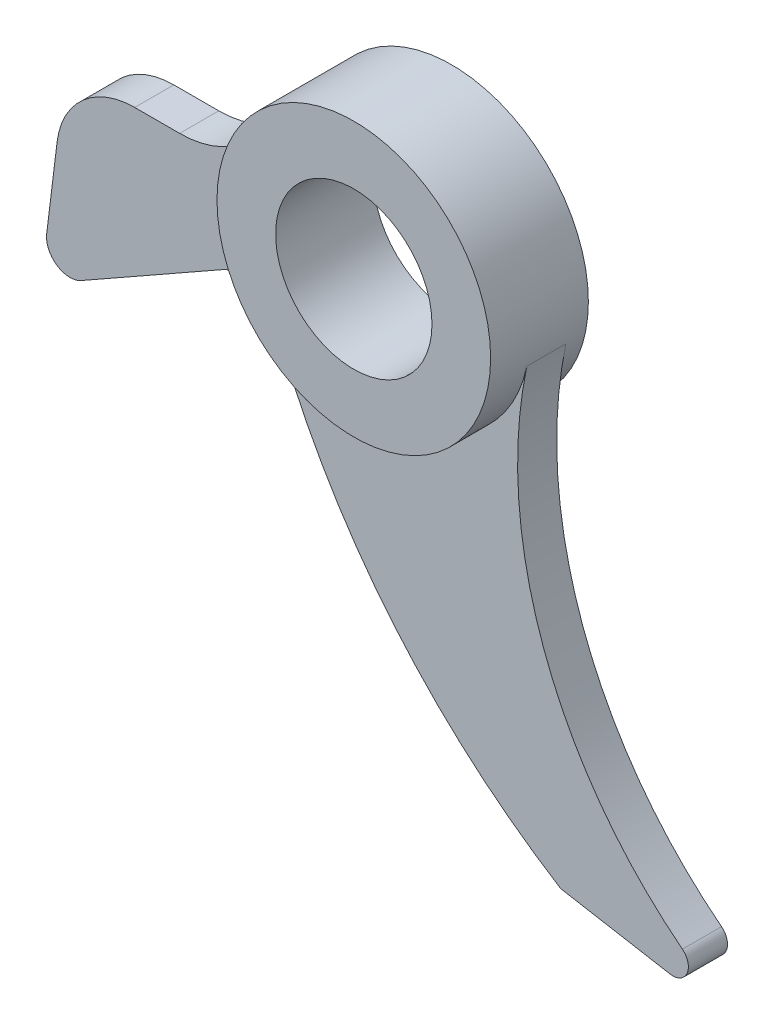
ISO-10303-21;
HEADER;
FILE_DESCRIPTION(('STEP AP214'),'2;1');
FILE_NAME('part.step','',(''),(''),'','','');
FILE_SCHEMA(('AUTOMOTIVE_DESIGN { 1 0 10303 214 1 1 1 1 }'));
ENDSEC;
DATA;
#1=APPLICATION_CONTEXT('core data for automotive mechanical design processes');
#2=APPLICATION_PROTOCOL_DEFINITION('international standard','automotive_design',2000,#1);
#3=PRODUCT_CONTEXT('',#1,'mechanical');
#4=PRODUCT('Part','Part','',(#3));
#5=PRODUCT_RELATED_PRODUCT_CATEGORY('part','',(#4));
#6=PRODUCT_DEFINITION_FORMATION('','',#4);
#7=PRODUCT_DEFINITION_CONTEXT('part definition',#1,'design');
#8=PRODUCT_DEFINITION('design','',#6,#7);
#9=PRODUCT_DEFINITION_SHAPE('','',#8);
#10=(LENGTH_UNIT() NAMED_UNIT(*) SI_UNIT(.MILLI.,.METRE.));
#11=(NAMED_UNIT(*) PLANE_ANGLE_UNIT() SI_UNIT($,.RADIAN.));
#12=(NAMED_UNIT(*) SI_UNIT($,.STERADIAN.) SOLID_ANGLE_UNIT());
#13=UNCERTAINTY_MEASURE_WITH_UNIT(LENGTH_MEASURE(1.E-05),#10,'distance_accuracy_value','');
#14=(GEOMETRIC_REPRESENTATION_CONTEXT(3) GLOBAL_UNCERTAINTY_ASSIGNED_CONTEXT((#13)) GLOBAL_UNIT_ASSIGNED_CONTEXT((#10,
#11,#12)) REPRESENTATION_CONTEXT('',''));
#15=CARTESIAN_POINT('',(0.,0.,0.));
#16=DIRECTION('',(0.,0.,1.));
#17=DIRECTION('',(1.,0.,0.));
#18=AXIS2_PLACEMENT_3D('',#15,#16,#17);
#19=CARTESIAN_POINT('',(27.5928393996281,20.5375154884965,15.));
#20=DIRECTION('',(0.,0.,-1.));
#21=DIRECTION('',(-1.,0.,0.));
#22=AXIS2_PLACEMENT_3D('',#19,#20,#21);
#23=CYLINDRICAL_SURFACE('',#22,35.);
#24=CARTESIAN_POINT('',(27.5928393996281,20.5375154884965,5.));
#25=DIRECTION('',(0.,0.,1.));
#26=DIRECTION('',(1.,0.,0.));
#27=AXIS2_PLACEMENT_3D('',#24,#25,#26);
#28=CIRCLE('',#27,35.);
#29=CARTESIAN_POINT('',(-4.22423760139273,35.1208488218298,5.));
#30=VERTEX_POINT('',#29);
#31=CARTESIAN_POINT('',(61.844285818518,13.3376253355903,5.));
#32=VERTEX_POINT('',#31);
#33=EDGE_CURVE('E63',#30,#32,#28,.T.);
#34=ORIENTED_EDGE('',*,*,#33,.T.);
#35=DIRECTION('',(0.,0.,-1.));
#36=VECTOR('',#35,1.);
#37=CARTESIAN_POINT('',(61.844285818518,13.3376253355903,5.));
#38=LINE('',#37,#36);
#39=CARTESIAN_POINT('',(61.844285818518,13.3376253355903,-5.));
#40=VERTEX_POINT('',#39);
#41=EDGE_CURVE('E257',#32,#40,#38,.T.);
#42=ORIENTED_EDGE('',*,*,#41,.T.);
#43=CARTESIAN_POINT('',(27.5928393996281,20.5375154884965,-5.));
#44=DIRECTION('',(0.,0.,1.));
#45=DIRECTION('',(1.,0.,0.));
#46=AXIS2_PLACEMENT_3D('',#43,#44,#45);
#47=CIRCLE('',#46,35.);
#48=CARTESIAN_POINT('',(-4.22423760139273,35.1208488218298,-5.));
#49=VERTEX_POINT('',#48);
#50=EDGE_CURVE('E180',#49,#40,#47,.T.);
#51=ORIENTED_EDGE('',*,*,#50,.F.);
#52=DIRECTION('',(0.,0.,-1.));
#53=VECTOR('',#52,1.);
#54=CARTESIAN_POINT('',(-4.22423760139273,35.1208488218298,5.));
#55=LINE('',#54,#53);
#56=EDGE_CURVE('E66',#30,#49,#55,.T.);
#57=ORIENTED_EDGE('',*,*,#56,.F.);
#58=EDGE_LOOP('',(#34,#42,#51,#57));
#59=FACE_BOUND('',#58,.T.);
#60=CARTESIAN_POINT('',(27.5928393996281,20.5375154884965,15.));
#61=DIRECTION('',(0.,0.,1.));
#62=DIRECTION('',(1.,0.,0.));
#63=AXIS2_PLACEMENT_3D('',#60,#61,#62);
#64=CIRCLE('',#63,35.);
#65=CARTESIAN_POINT('',(62.5928393996281,20.5375154884965,15.));
#66=VERTEX_POINT('',#65);
#67=EDGE_CURVE('E60',#66,#66,#64,.T.);
#68=ORIENTED_EDGE('',*,*,#67,.F.);
#69=EDGE_LOOP('',(#68));
#70=FACE_BOUND('',#69,.T.);
#71=CARTESIAN_POINT('',(27.5928393996281,20.5375154884965,-10.));
#72=DIRECTION('',(0.,0.,1.));
#73=DIRECTION('',(1.,0.,0.));
#74=AXIS2_PLACEMENT_3D('',#71,#72,#73);
#75=CIRCLE('',#74,35.);
#76=CARTESIAN_POINT('',(62.5928393996281,20.5375154884965,-10.));
#77=VERTEX_POINT('',#76);
#78=EDGE_CURVE('E150',#77,#77,#75,.T.);
#79=ORIENTED_EDGE('',*,*,#78,.T.);
#80=EDGE_LOOP('',(#79));
#81=FACE_BOUND('',#80,.T.);
#82=ADVANCED_FACE('F47',(#59,#70,#81),#23,.T.);
#83=CARTESIAN_POINT('',(27.5928393996281,20.5375154884965,15.));
#84=DIRECTION('',(0.,0.,-1.));
#85=DIRECTION('',(-1.,0.,0.));
#86=AXIS2_PLACEMENT_3D('',#83,#84,#85);
#87=CYLINDRICAL_SURFACE('',#86,20.);
#88=CARTESIAN_POINT('',(27.5928393996281,20.5375154884965,15.));
#89=DIRECTION('',(0.,0.,1.));
#90=DIRECTION('',(1.,0.,0.));
#91=AXIS2_PLACEMENT_3D('',#88,#89,#90);
#92=CIRCLE('',#91,20.);
#93=CARTESIAN_POINT('',(47.5928393996281,20.5375154884965,15.));
#94=VERTEX_POINT('',#93);
#95=EDGE_CURVE('E11',#94,#94,#92,.T.);
#96=ORIENTED_EDGE('',*,*,#95,.T.);
#97=EDGE_LOOP('',(#96));
#98=FACE_BOUND('',#97,.T.);
#99=CARTESIAN_POINT('',(27.5928393996281,20.5375154884965,-10.));
#100=DIRECTION('',(0.,0.,1.));
#101=DIRECTION('',(1.,0.,0.));
#102=AXIS2_PLACEMENT_3D('',#99,#100,#101);
#103=CIRCLE('',#102,20.);
#104=CARTESIAN_POINT('',(47.5928393996281,20.5375154884965,-10.));
#105=VERTEX_POINT('',#104);
#106=EDGE_CURVE('E273',#105,#105,#103,.T.);
#107=ORIENTED_EDGE('',*,*,#106,.F.);
#108=EDGE_LOOP('',(#107));
#109=FACE_BOUND('',#108,.T.);
#110=ADVANCED_FACE('F287',(#98,#109),#87,.F.);
#111=CARTESIAN_POINT('',(0.,0.,15.));
#112=DIRECTION('',(0.,0.,1.));
#113=DIRECTION('',(1.,0.,0.));
#114=AXIS2_PLACEMENT_3D('',#111,#112,#113);
#115=PLANE('',#114);
#116=ORIENTED_EDGE('',*,*,#67,.T.);
#117=EDGE_LOOP('',(#116));
#118=FACE_BOUND('',#117,.T.);
#119=ORIENTED_EDGE('',*,*,#95,.F.);
#120=EDGE_LOOP('',(#119));
#121=FACE_BOUND('',#120,.T.);
#122=ADVANCED_FACE('F284',(#118,#121),#115,.T.);
#123=CARTESIAN_POINT('',(0.,0.,-10.));
#124=DIRECTION('',(0.,0.,1.));
#125=DIRECTION('',(1.,0.,0.));
#126=AXIS2_PLACEMENT_3D('',#123,#124,#125);
#127=PLANE('',#126);
#128=ORIENTED_EDGE('',*,*,#78,.F.);
#129=EDGE_LOOP('',(#128));
#130=FACE_BOUND('',#129,.T.);
#131=ORIENTED_EDGE('',*,*,#106,.T.);
#132=EDGE_LOOP('',(#131));
#133=FACE_BOUND('',#132,.T.);
#134=ADVANCED_FACE('F286',(#130,#133),#127,.F.);
#135=CARTESIAN_POINT('',(-11.0627773534914,-12.8665463943155,5.));
#136=DIRECTION('',(0.,0.,-1.));
#137=DIRECTION('',(-1.,0.,0.));
#138=AXIS2_PLACEMENT_3D('',#135,#136,#137);
#139=CYLINDRICAL_SURFACE('',#138,9.99999999999999);
#140=DIRECTION('',(0.,0.,-1.));
#141=VECTOR('',#140,1.);
#142=CARTESIAN_POINT('',(-15.9936966431084,-4.16677427320317,5.));
#143=LINE('',#142,#141);
#144=CARTESIAN_POINT('',(-15.9936966431084,-4.16677427320317,5.));
#145=VERTEX_POINT('',#144);
#146=CARTESIAN_POINT('',(-15.9936966431084,-4.16677427320317,-5.));
#147=VERTEX_POINT('',#146);
#148=EDGE_CURVE('E152',#145,#147,#143,.T.);
#149=ORIENTED_EDGE('',*,*,#148,.T.);
#150=CARTESIAN_POINT('',(-11.0627773534914,-12.8665463943155,-5.));
#151=DIRECTION('',(0.,0.,1.));
#152=DIRECTION('',(1.,0.,0.));
#153=AXIS2_PLACEMENT_3D('',#150,#151,#152);
#154=CIRCLE('',#153,9.99999999999999);
#155=CARTESIAN_POINT('',(-1.06278127454067,-12.8754019558132,-5.));
#156=VERTEX_POINT('',#155);
#157=EDGE_CURVE('E151',#156,#147,#154,.T.);
#158=ORIENTED_EDGE('',*,*,#157,.F.);
#159=DIRECTION('',(0.,0.,-1.));
#160=VECTOR('',#159,1.);
#161=CARTESIAN_POINT('',(-1.06278127454067,-12.8754019558132,5.));
#162=LINE('',#161,#160);
#163=CARTESIAN_POINT('',(-1.06278127454067,-12.8754019558132,5.));
#164=VERTEX_POINT('',#163);
#165=EDGE_CURVE('E137',#164,#156,#162,.T.);
#166=ORIENTED_EDGE('',*,*,#165,.F.);
#167=CARTESIAN_POINT('',(-11.0627773534914,-12.8665463943155,5.));
#168=DIRECTION('',(0.,0.,1.));
#169=DIRECTION('',(1.,0.,0.));
#170=AXIS2_PLACEMENT_3D('',#167,#168,#169);
#171=CIRCLE('',#170,9.99999999999999);
#172=EDGE_CURVE('E202',#164,#145,#171,.T.);
#173=ORIENTED_EDGE('',*,*,#172,.T.);
#174=EDGE_LOOP('',(#149,#158,#166,#173));
#175=FACE_BOUND('',#174,.T.);
#176=ADVANCED_FACE('F155',(#175),#139,.F.);
#177=CARTESIAN_POINT('',(165.764836614489,54.7156174881517,5.));
#178=DIRECTION('',(0.,0.,-1.));
#179=DIRECTION('',(-1.,0.,0.));
#180=AXIS2_PLACEMENT_3D('',#177,#178,#179);
#181=CYLINDRICAL_SURFACE('',#180,180.000000000007);
#182=ORIENTED_EDGE('',*,*,#165,.T.);
#183=CARTESIAN_POINT('',(165.764836614489,54.7156174881517,-5.));
#184=DIRECTION('',(0.,0.,1.));
#185=DIRECTION('',(1.,0.,0.));
#186=AXIS2_PLACEMENT_3D('',#183,#184,#185);
#187=CIRCLE('',#186,180.000000000007);
#188=CARTESIAN_POINT('',(70.5461838212282,-98.0371506053889,-5.));
#189=VERTEX_POINT('',#188);
#190=EDGE_CURVE('E143',#156,#189,#187,.T.);
#191=ORIENTED_EDGE('',*,*,#190,.T.);
#192=DIRECTION('',(0.,0.,-1.));
#193=VECTOR('',#192,1.);
#194=CARTESIAN_POINT('',(70.5461838212282,-98.0371506053889,5.));
#195=LINE('',#194,#193);
#196=CARTESIAN_POINT('',(70.5461838212282,-98.0371506053889,5.));
#197=VERTEX_POINT('',#196);
#198=EDGE_CURVE('E146',#197,#189,#195,.T.);
#199=ORIENTED_EDGE('',*,*,#198,.F.);
#200=CARTESIAN_POINT('',(165.764836614489,54.7156174881517,5.));
#201=DIRECTION('',(0.,0.,1.));
#202=DIRECTION('',(1.,0.,0.));
#203=AXIS2_PLACEMENT_3D('',#200,#201,#202);
#204=CIRCLE('',#203,180.000000000007);
#205=EDGE_CURVE('E142',#164,#197,#204,.T.);
#206=ORIENTED_EDGE('',*,*,#205,.F.);
#207=EDGE_LOOP('',(#182,#191,#199,#206));
#208=FACE_BOUND('',#207,.T.);
#209=ADVANCED_FACE('F140',(#208),#181,.T.);
#210=CARTESIAN_POINT('',(-14.6381124207408,-83.016860845267,5.));
#211=DIRECTION('',(0.173648177666931,0.984807753012208,0.));
#212=DIRECTION('',(-0.984807753012208,0.173648177666931,0.));
#213=AXIS2_PLACEMENT_3D('',#210,#211,#212);
#214=PLANE('',#213);
#215=ORIENTED_EDGE('',*,*,#198,.T.);
#216=DIRECTION('',(0.984807753012208,-0.173648177666931,0.));
#217=VECTOR('',#216,1.);
#218=CARTESIAN_POINT('',(-14.6381124207408,-83.016860845267,-5.));
#219=LINE('',#218,#217);
#220=CARTESIAN_POINT('',(98.4843139750302,-102.963396742049,-5.));
#221=VERTEX_POINT('',#220);
#222=EDGE_CURVE('E163',#189,#221,#219,.T.);
#223=ORIENTED_EDGE('',*,*,#222,.T.);
#224=DIRECTION('',(0.,0.,-1.));
#225=VECTOR('',#224,1.);
#226=CARTESIAN_POINT('',(98.4843139750302,-102.963396742049,5.));
#227=LINE('',#226,#225);
#228=CARTESIAN_POINT('',(98.4843139750302,-102.963396742049,5.));
#229=VERTEX_POINT('',#228);
#230=EDGE_CURVE('E266',#229,#221,#227,.T.);
#231=ORIENTED_EDGE('',*,*,#230,.F.);
#232=DIRECTION('',(0.984807753012208,-0.173648177666931,0.));
#233=VECTOR('',#232,1.);
#234=CARTESIAN_POINT('',(-14.6381124207408,-83.016860845267,5.));
#235=LINE('',#234,#233);
#236=EDGE_CURVE('E209',#197,#229,#235,.T.);
#237=ORIENTED_EDGE('',*,*,#236,.F.);
#238=EDGE_LOOP('',(#215,#223,#231,#237));
#239=FACE_BOUND('',#238,.T.);
#240=ADVANCED_FACE('F308',(#239),#214,.F.);
#241=CARTESIAN_POINT('',(99.1789066856979,-99.0241657300001,5.));
#242=DIRECTION('',(0.,0.,-1.));
#243=DIRECTION('',(-1.,0.,0.));
#244=AXIS2_PLACEMENT_3D('',#241,#242,#243);
#245=CYLINDRICAL_SURFACE('',#244,3.99999999999998);
#246=ORIENTED_EDGE('',*,*,#230,.T.);
#247=CARTESIAN_POINT('',(99.1789066856979,-99.0241657300001,-5.));
#248=DIRECTION('',(0.,0.,1.));
#249=DIRECTION('',(1.,0.,0.));
#250=AXIS2_PLACEMENT_3D('',#247,#248,#249);
#251=CIRCLE('',#250,3.99999999999998);
#252=CARTESIAN_POINT('',(101.646021849334,-95.8756195941845,-5.));
#253=VERTEX_POINT('',#252);
#254=EDGE_CURVE('E169',#221,#253,#251,.T.);
#255=ORIENTED_EDGE('',*,*,#254,.T.);
#256=DIRECTION('',(0.,0.,-1.));
#257=VECTOR('',#256,1.);
#258=CARTESIAN_POINT('',(101.646021849334,-95.8756195941845,5.));
#259=LINE('',#258,#257);
#260=CARTESIAN_POINT('',(101.646021849334,-95.8756195941845,5.));
#261=VERTEX_POINT('',#260);
#262=EDGE_CURVE('E263',#261,#253,#259,.T.);
#263=ORIENTED_EDGE('',*,*,#262,.F.);
#264=CARTESIAN_POINT('',(99.1789066856979,-99.0241657300001,5.));
#265=DIRECTION('',(0.,0.,1.));
#266=DIRECTION('',(1.,0.,0.));
#267=AXIS2_PLACEMENT_3D('',#264,#265,#266);
#268=CIRCLE('',#267,3.99999999999998);
#269=EDGE_CURVE('E213',#229,#261,#268,.T.);
#270=ORIENTED_EDGE('',*,*,#269,.F.);
#271=EDGE_LOOP('',(#246,#255,#263,#270));
#272=FACE_BOUND('',#271,.T.);
#273=ADVANCED_FACE('F310',(#272),#245,.T.);
#274=CARTESIAN_POINT('',(169.491688849315,-9.29060085925756,5.));
#275=DIRECTION('',(0.,0.,-1.));
#276=DIRECTION('',(-1.,0.,0.));
#277=AXIS2_PLACEMENT_3D('',#274,#275,#276);
#278=CYLINDRICAL_SURFACE('',#277,110.);
#279=ORIENTED_EDGE('',*,*,#262,.T.);
#280=CARTESIAN_POINT('',(169.491688849315,-9.29060085925756,-5.));
#281=DIRECTION('',(0.,0.,1.));
#282=DIRECTION('',(1.,0.,0.));
#283=AXIS2_PLACEMENT_3D('',#280,#281,#282);
#284=CIRCLE('',#283,110.);
#285=EDGE_CURVE('E173',#40,#253,#284,.T.);
#286=ORIENTED_EDGE('',*,*,#285,.F.);
#287=ORIENTED_EDGE('',*,*,#41,.F.);
#288=CARTESIAN_POINT('',(169.491688849315,-9.29060085925756,5.));
#289=DIRECTION('',(0.,0.,1.));
#290=DIRECTION('',(1.,0.,0.));
#291=AXIS2_PLACEMENT_3D('',#288,#289,#290);
#292=CIRCLE('',#291,110.);
#293=EDGE_CURVE('E216',#32,#261,#292,.T.);
#294=ORIENTED_EDGE('',*,*,#293,.T.);
#295=EDGE_LOOP('',(#279,#286,#287,#294));
#296=FACE_BOUND('',#295,.T.);
#297=ADVANCED_FACE('F311',(#296),#278,.F.);
#298=CARTESIAN_POINT('',(-26.9507211735505,45.5375154884965,5.));
#299=DIRECTION('',(0.,0.,-1.));
#300=DIRECTION('',(-1.,0.,0.));
#301=AXIS2_PLACEMENT_3D('',#298,#299,#300);
#302=CYLINDRICAL_SURFACE('',#301,25.);
#303=ORIENTED_EDGE('',*,*,#56,.T.);
#304=CARTESIAN_POINT('',(-26.9507211735505,45.5375154884965,-5.));
#305=DIRECTION('',(0.,0.,1.));
#306=DIRECTION('',(1.,0.,0.));
#307=AXIS2_PLACEMENT_3D('',#304,#305,#306);
#308=CIRCLE('',#307,25.);
#309=CARTESIAN_POINT('',(-26.9507211735505,20.5375154884965,-5.));
#310=VERTEX_POINT('',#309);
#311=EDGE_CURVE('E185',#310,#49,#308,.T.);
#312=ORIENTED_EDGE('',*,*,#311,.F.);
#313=DIRECTION('',(0.,0.,-1.));
#314=VECTOR('',#313,1.);
#315=CARTESIAN_POINT('',(-26.9507211735505,20.5375154884965,5.));
#316=LINE('',#315,#314);
#317=CARTESIAN_POINT('',(-26.9507211735505,20.5375154884965,5.));
#318=VERTEX_POINT('',#317);
#319=EDGE_CURVE('E254',#318,#310,#316,.T.);
#320=ORIENTED_EDGE('',*,*,#319,.F.);
#321=CARTESIAN_POINT('',(-26.9507211735505,45.5375154884965,5.));
#322=DIRECTION('',(0.,0.,1.));
#323=DIRECTION('',(1.,0.,0.));
#324=AXIS2_PLACEMENT_3D('',#321,#322,#323);
#325=CIRCLE('',#324,25.);
#326=EDGE_CURVE('E225',#318,#30,#325,.T.);
#327=ORIENTED_EDGE('',*,*,#326,.T.);
#328=EDGE_LOOP('',(#303,#312,#320,#327));
#329=FACE_BOUND('',#328,.T.);
#330=ADVANCED_FACE('F320',(#329),#302,.F.);
#331=CARTESIAN_POINT('',(0.,20.5375154884965,5.));
#332=DIRECTION('',(0.,-1.,0.));
#333=DIRECTION('',(0.,0.,-1.));
#334=AXIS2_PLACEMENT_3D('',#331,#332,#333);
#335=PLANE('',#334);
#336=ORIENTED_EDGE('',*,*,#319,.T.);
#337=DIRECTION('',(-1.,0.,0.));
#338=VECTOR('',#337,1.);
#339=CARTESIAN_POINT('',(0.,20.5375154884965,-5.));
#340=LINE('',#339,#338);
#341=CARTESIAN_POINT('',(-38.4493109795941,20.5375154884965,-5.));
#342=VERTEX_POINT('',#341);
#343=EDGE_CURVE('E189',#310,#342,#340,.T.);
#344=ORIENTED_EDGE('',*,*,#343,.T.);
#345=DIRECTION('',(0.,0.,-1.));
#346=VECTOR('',#345,1.);
#347=CARTESIAN_POINT('',(-38.4493109795941,20.5375154884965,5.));
#348=LINE('',#347,#346);
#349=CARTESIAN_POINT('',(-38.4493109795941,20.5375154884965,5.));
#350=VERTEX_POINT('',#349);
#351=EDGE_CURVE('E252',#350,#342,#348,.T.);
#352=ORIENTED_EDGE('',*,*,#351,.F.);
#353=DIRECTION('',(-1.,0.,0.));
#354=VECTOR('',#353,1.);
#355=CARTESIAN_POINT('',(0.,20.5375154884965,5.));
#356=LINE('',#355,#354);
#357=EDGE_CURVE('E229',#318,#350,#356,.T.);
#358=ORIENTED_EDGE('',*,*,#357,.F.);
#359=EDGE_LOOP('',(#336,#344,#352,#358));
#360=FACE_BOUND('',#359,.T.);
#361=ADVANCED_FACE('F321',(#360),#335,.F.);
#362=CARTESIAN_POINT('',(-38.4493109795941,0.537515488496464,5.));
#363=DIRECTION('',(0.,0.,-1.));
#364=DIRECTION('',(-1.,0.,0.));
#365=AXIS2_PLACEMENT_3D('',#362,#363,#364);
#366=CYLINDRICAL_SURFACE('',#365,20.);
#367=ORIENTED_EDGE('',*,*,#351,.T.);
#368=CARTESIAN_POINT('',(-38.4493109795941,0.537515488496464,-5.));
#369=DIRECTION('',(0.,0.,1.));
#370=DIRECTION('',(1.,0.,0.));
#371=AXIS2_PLACEMENT_3D('',#368,#369,#370);
#372=CIRCLE('',#371,20.);
#373=CARTESIAN_POINT('',(-58.3002340124206,2.97490235659928,-5.));
#374=VERTEX_POINT('',#373);
#375=EDGE_CURVE('E187',#342,#374,#372,.T.);
#376=ORIENTED_EDGE('',*,*,#375,.T.);
#377=DIRECTION('',(0.,0.,-1.));
#378=VECTOR('',#377,1.);
#379=CARTESIAN_POINT('',(-58.3002340124206,2.97490235659928,5.));
#380=LINE('',#379,#378);
#381=CARTESIAN_POINT('',(-58.3002340124206,2.97490235659928,5.));
#382=VERTEX_POINT('',#381);
#383=EDGE_CURVE('E246',#382,#374,#380,.T.);
#384=ORIENTED_EDGE('',*,*,#383,.F.);
#385=CARTESIAN_POINT('',(-38.4493109795941,0.537515488496464,5.));
#386=DIRECTION('',(0.,0.,1.));
#387=DIRECTION('',(1.,0.,0.));
#388=AXIS2_PLACEMENT_3D('',#385,#386,#387);
#389=CIRCLE('',#388,20.);
#390=EDGE_CURVE('E228',#350,#382,#389,.T.);
#391=ORIENTED_EDGE('',*,*,#390,.F.);
#392=EDGE_LOOP('',(#367,#376,#384,#391));
#393=FACE_BOUND('',#392,.T.);
#394=ADVANCED_FACE('F324',(#393),#366,.T.);
#395=CARTESIAN_POINT('',(-57.7941979664477,7.09623522004542,5.));
#396=DIRECTION('',(0.992546151641323,-0.121869343405141,0.));
#397=DIRECTION('',(0.121869343405141,0.992546151641323,0.));
#398=AXIS2_PLACEMENT_3D('',#395,#396,#397);
#399=PLANE('',#398);
#400=ORIENTED_EDGE('',*,*,#383,.T.);
#401=DIRECTION('',(-0.121869343405141,-0.992546151641323,0.));
#402=VECTOR('',#401,1.);
#403=CARTESIAN_POINT('',(-57.7941979664477,7.09623522004542,-5.));
#404=LINE('',#403,#402);
#405=CARTESIAN_POINT('',(-60.957304489609,-18.6652000931685,-5.));
#406=VERTEX_POINT('',#405);
#407=EDGE_CURVE('E191',#374,#406,#404,.T.);
#408=ORIENTED_EDGE('',*,*,#407,.T.);
#409=DIRECTION('',(0.,0.,-1.));
#410=VECTOR('',#409,1.);
#411=CARTESIAN_POINT('',(-60.957304489609,-18.6652000931685,5.));
#412=LINE('',#411,#410);
#413=CARTESIAN_POINT('',(-60.957304489609,-18.6652000931685,5.));
#414=VERTEX_POINT('',#413);
#415=EDGE_CURVE('E247',#414,#406,#412,.T.);
#416=ORIENTED_EDGE('',*,*,#415,.F.);
#417=DIRECTION('',(-0.121869343405141,-0.992546151641323,0.));
#418=VECTOR('',#417,1.);
#419=CARTESIAN_POINT('',(-57.7941979664477,7.09623522004542,5.));
#420=LINE('',#419,#418);
#421=EDGE_CURVE('E234',#382,#414,#420,.T.);
#422=ORIENTED_EDGE('',*,*,#421,.F.);
#423=EDGE_LOOP('',(#400,#408,#416,#422));
#424=FACE_BOUND('',#423,.T.);
#425=ADVANCED_FACE('F328',(#424),#399,.F.);
#426=CARTESIAN_POINT('',(-55.0020275797611,-19.3964161535994,5.));
#427=DIRECTION('',(0.,0.,-1.));
#428=DIRECTION('',(-1.,0.,0.));
#429=AXIS2_PLACEMENT_3D('',#426,#427,#428);
#430=CYLINDRICAL_SURFACE('',#429,6.);
#431=ORIENTED_EDGE('',*,*,#415,.T.);
#432=CARTESIAN_POINT('',(-55.0020275797611,-19.3964161535994,-5.));
#433=DIRECTION('',(0.,0.,1.));
#434=DIRECTION('',(1.,0.,0.));
#435=AXIS2_PLACEMENT_3D('',#432,#433,#434);
#436=CIRCLE('',#435,6.);
#437=CARTESIAN_POINT('',(-51.6849837714041,-24.3961381832167,-5.));
#438=VERTEX_POINT('',#437);
#439=EDGE_CURVE('E196',#406,#438,#436,.T.);
#440=ORIENTED_EDGE('',*,*,#439,.T.);
#441=DIRECTION('',(0.,0.,-1.));
#442=VECTOR('',#441,1.);
#443=CARTESIAN_POINT('',(-51.6849837714041,-24.3961381832167,5.));
#444=LINE('',#443,#442);
#445=CARTESIAN_POINT('',(-51.6849837714041,-24.3961381832167,5.));
#446=VERTEX_POINT('',#445);
#447=EDGE_CURVE('E245',#446,#438,#444,.T.);
#448=ORIENTED_EDGE('',*,*,#447,.F.);
#449=CARTESIAN_POINT('',(-55.0020275797611,-19.3964161535994,5.));
#450=DIRECTION('',(0.,0.,1.));
#451=DIRECTION('',(1.,0.,0.));
#452=AXIS2_PLACEMENT_3D('',#449,#450,#451);
#453=CIRCLE('',#452,6.);
#454=EDGE_CURVE('E233',#414,#446,#453,.T.);
#455=ORIENTED_EDGE('',*,*,#454,.F.);
#456=EDGE_LOOP('',(#431,#440,#448,#455));
#457=FACE_BOUND('',#456,.T.);
#458=ADVANCED_FACE('F334',(#457),#430,.T.);
#459=CARTESIAN_POINT('',(-2.10124422597101,3.70728962756371,5.));
#460=DIRECTION('',(-0.493091928961698,0.869977212111233,0.));
#461=DIRECTION('',(-0.869977212111233,-0.493091928961698,0.));
#462=AXIS2_PLACEMENT_3D('',#459,#460,#461);
#463=PLANE('',#462);
#464=ORIENTED_EDGE('',*,*,#447,.T.);
#465=DIRECTION('',(0.869977212111233,0.493091928961698,0.));
#466=VECTOR('',#465,1.);
#467=CARTESIAN_POINT('',(-2.10124422597101,3.70728962756371,-5.));
#468=LINE('',#467,#466);
#469=EDGE_CURVE('E205',#438,#147,#468,.T.);
#470=ORIENTED_EDGE('',*,*,#469,.T.);
#471=ORIENTED_EDGE('',*,*,#148,.F.);
#472=DIRECTION('',(0.869977212111233,0.493091928961698,0.));
#473=VECTOR('',#472,1.);
#474=CARTESIAN_POINT('',(-2.10124422597101,3.70728962756371,5.));
#475=LINE('',#474,#473);
#476=EDGE_CURVE('E236',#446,#145,#475,.T.);
#477=ORIENTED_EDGE('',*,*,#476,.F.);
#478=EDGE_LOOP('',(#464,#470,#471,#477));
#479=FACE_BOUND('',#478,.T.);
#480=ADVANCED_FACE('F336',(#479),#463,.F.);
#481=CARTESIAN_POINT('',(0.,0.,5.));
#482=DIRECTION('',(0.,0.,1.));
#483=DIRECTION('',(1.,0.,0.));
#484=AXIS2_PLACEMENT_3D('',#481,#482,#483);
#485=PLANE('',#484);
#486=ORIENTED_EDGE('',*,*,#172,.F.);
#487=ORIENTED_EDGE('',*,*,#205,.T.);
#488=ORIENTED_EDGE('',*,*,#236,.T.);
#489=ORIENTED_EDGE('',*,*,#269,.T.);
#490=ORIENTED_EDGE('',*,*,#293,.F.);
#491=ORIENTED_EDGE('',*,*,#33,.F.);
#492=ORIENTED_EDGE('',*,*,#326,.F.);
#493=ORIENTED_EDGE('',*,*,#357,.T.);
#494=ORIENTED_EDGE('',*,*,#390,.T.);
#495=ORIENTED_EDGE('',*,*,#421,.T.);
#496=ORIENTED_EDGE('',*,*,#454,.T.);
#497=ORIENTED_EDGE('',*,*,#476,.T.);
#498=EDGE_LOOP('',(#486,#487,#488,#489,#490,#491,#492,#493,#494,#495,#496,#497));
#499=FACE_BOUND('',#498,.T.);
#500=ADVANCED_FACE('F342',(#499),#485,.T.);
#501=CARTESIAN_POINT('',(0.,0.,-5.));
#502=DIRECTION('',(0.,0.,1.));
#503=DIRECTION('',(1.,0.,0.));
#504=AXIS2_PLACEMENT_3D('',#501,#502,#503);
#505=PLANE('',#504);
#506=ORIENTED_EDGE('',*,*,#157,.T.);
#507=ORIENTED_EDGE('',*,*,#469,.F.);
#508=ORIENTED_EDGE('',*,*,#439,.F.);
#509=ORIENTED_EDGE('',*,*,#407,.F.);
#510=ORIENTED_EDGE('',*,*,#375,.F.);
#511=ORIENTED_EDGE('',*,*,#343,.F.);
#512=ORIENTED_EDGE('',*,*,#311,.T.);
#513=ORIENTED_EDGE('',*,*,#50,.T.);
#514=ORIENTED_EDGE('',*,*,#285,.T.);
#515=ORIENTED_EDGE('',*,*,#254,.F.);
#516=ORIENTED_EDGE('',*,*,#222,.F.);
#517=ORIENTED_EDGE('',*,*,#190,.F.);
#518=EDGE_LOOP('',(#506,#507,#508,#509,#510,#511,#512,#513,#514,#515,#516,#517));
#519=FACE_BOUND('',#518,.T.);
#520=ADVANCED_FACE('F161',(#519),#505,.F.);
#521=CLOSED_SHELL('',(#82,#110,#122,#134,#176,#209,#240,#273,#297,#330,#361,#394,#425,#458,#480,
#500,#520));
#522=MANIFOLD_SOLID_BREP('B2',#521);
#523=ADVANCED_BREP_SHAPE_REPRESENTATION('',(#18,#522),#14);
#524=SHAPE_DEFINITION_REPRESENTATION(#9,#523);
ENDSEC;
END-ISO-10303-21;
